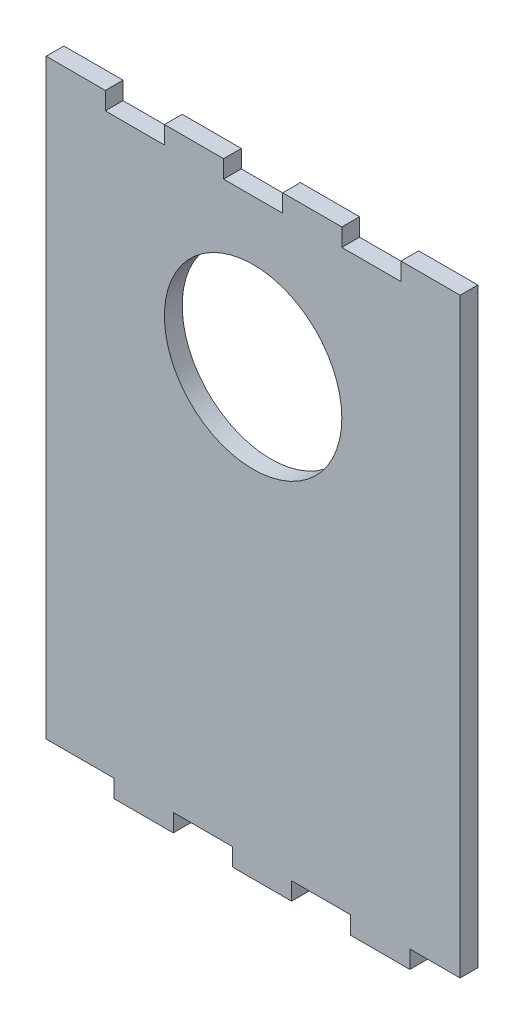
ISO-10303-21;
HEADER;
FILE_DESCRIPTION(('STEP AP214'),'2;1');
FILE_NAME('part.step','',(''),(''),'','','');
FILE_SCHEMA(('AUTOMOTIVE_DESIGN { 1 0 10303 214 1 1 1 1 }'));
ENDSEC;
DATA;
#1=APPLICATION_CONTEXT('core data for automotive mechanical design processes');
#2=APPLICATION_PROTOCOL_DEFINITION('international standard','automotive_design',2000,#1);
#3=PRODUCT_CONTEXT('',#1,'mechanical');
#4=PRODUCT('Part','Part','',(#3));
#5=PRODUCT_RELATED_PRODUCT_CATEGORY('part','',(#4));
#6=PRODUCT_DEFINITION_FORMATION('','',#4);
#7=PRODUCT_DEFINITION_CONTEXT('part definition',#1,'design');
#8=PRODUCT_DEFINITION('design','',#6,#7);
#9=PRODUCT_DEFINITION_SHAPE('','',#8);
#10=(LENGTH_UNIT() NAMED_UNIT(*) SI_UNIT(.MILLI.,.METRE.));
#11=(NAMED_UNIT(*) PLANE_ANGLE_UNIT() SI_UNIT($,.RADIAN.));
#12=(NAMED_UNIT(*) SI_UNIT($,.STERADIAN.) SOLID_ANGLE_UNIT());
#13=UNCERTAINTY_MEASURE_WITH_UNIT(LENGTH_MEASURE(1.E-05),#10,'distance_accuracy_value','');
#14=(GEOMETRIC_REPRESENTATION_CONTEXT(3) GLOBAL_UNCERTAINTY_ASSIGNED_CONTEXT((#13)) GLOBAL_UNIT_ASSIGNED_CONTEXT((#10,
#11,#12)) REPRESENTATION_CONTEXT('',''));
#15=CARTESIAN_POINT('',(0.,0.,0.));
#16=DIRECTION('',(0.,0.,1.));
#17=DIRECTION('',(1.,0.,0.));
#18=AXIS2_PLACEMENT_3D('',#15,#16,#17);
#19=CARTESIAN_POINT('',(0.,50.,3.));
#20=DIRECTION('',(0.,1.,0.));
#21=DIRECTION('',(0.,0.,1.));
#22=AXIS2_PLACEMENT_3D('',#19,#20,#21);
#23=PLANE('',#22);
#24=DIRECTION('',(0.,0.,1.));
#25=VECTOR('',#24,1.);
#26=CARTESIAN_POINT('',(-25.,50.,0.));
#27=LINE('',#26,#25);
#28=CARTESIAN_POINT('',(-25.,50.,0.));
#29=VERTEX_POINT('',#28);
#30=CARTESIAN_POINT('',(-25.,50.,3.));
#31=VERTEX_POINT('',#30);
#32=EDGE_CURVE('E271',#29,#31,#27,.T.);
#33=ORIENTED_EDGE('',*,*,#32,.F.);
#34=DIRECTION('',(1.,0.,0.));
#35=VECTOR('',#34,1.);
#36=CARTESIAN_POINT('',(0.,50.,0.));
#37=LINE('',#36,#35);
#38=CARTESIAN_POINT('',(-35.,50.,0.));
#39=VERTEX_POINT('',#38);
#40=EDGE_CURVE('E253',#39,#29,#37,.T.);
#41=ORIENTED_EDGE('',*,*,#40,.F.);
#42=DIRECTION('',(0.,0.,-1.));
#43=VECTOR('',#42,1.);
#44=CARTESIAN_POINT('',(-35.,50.,3.));
#45=LINE('',#44,#43);
#46=CARTESIAN_POINT('',(-35.,50.,3.));
#47=VERTEX_POINT('',#46);
#48=EDGE_CURVE('E457',#47,#39,#45,.T.);
#49=ORIENTED_EDGE('',*,*,#48,.F.);
#50=DIRECTION('',(1.,0.,0.));
#51=VECTOR('',#50,1.);
#52=CARTESIAN_POINT('',(0.,50.,3.));
#53=LINE('',#52,#51);
#54=EDGE_CURVE('E395',#47,#31,#53,.T.);
#55=ORIENTED_EDGE('',*,*,#54,.T.);
#56=EDGE_LOOP('',(#33,#41,#49,#55));
#57=FACE_BOUND('',#56,.T.);
#58=ADVANCED_FACE('F44',(#57),#23,.T.);
#59=DIRECTION('',(0.,0.,1.));
#60=VECTOR('',#59,1.);
#61=CARTESIAN_POINT('',(15.,50.,0.));
#62=LINE('',#61,#60);
#63=CARTESIAN_POINT('',(15.,50.,0.));
#64=VERTEX_POINT('',#63);
#65=CARTESIAN_POINT('',(15.,50.,3.));
#66=VERTEX_POINT('',#65);
#67=EDGE_CURVE('E291',#64,#66,#62,.T.);
#68=ORIENTED_EDGE('',*,*,#67,.F.);
#69=CARTESIAN_POINT('',(5.,50.,0.));
#70=VERTEX_POINT('',#69);
#71=EDGE_CURVE('E539',#70,#64,#37,.T.);
#72=ORIENTED_EDGE('',*,*,#71,.F.);
#73=DIRECTION('',(0.,0.,1.));
#74=VECTOR('',#73,1.);
#75=CARTESIAN_POINT('',(5.,50.,0.));
#76=LINE('',#75,#74);
#77=CARTESIAN_POINT('',(5.,50.,3.));
#78=VERTEX_POINT('',#77);
#79=EDGE_CURVE('E322',#70,#78,#76,.T.);
#80=ORIENTED_EDGE('',*,*,#79,.T.);
#81=EDGE_CURVE('E984',#78,#66,#53,.T.);
#82=ORIENTED_EDGE('',*,*,#81,.T.);
#83=EDGE_LOOP('',(#68,#72,#80,#82));
#84=FACE_BOUND('',#83,.T.);
#85=ADVANCED_FACE('F609',(#84),#23,.T.);
#86=DIRECTION('',(0.,0.,1.));
#87=VECTOR('',#86,1.);
#88=CARTESIAN_POINT('',(-15.,50.,0.));
#89=LINE('',#88,#87);
#90=CARTESIAN_POINT('',(-15.,50.,0.));
#91=VERTEX_POINT('',#90);
#92=CARTESIAN_POINT('',(-15.,50.,3.));
#93=VERTEX_POINT('',#92);
#94=EDGE_CURVE('E275',#91,#93,#89,.T.);
#95=ORIENTED_EDGE('',*,*,#94,.T.);
#96=CARTESIAN_POINT('',(-5.,50.,3.));
#97=VERTEX_POINT('',#96);
#98=EDGE_CURVE('E400',#93,#97,#53,.T.);
#99=ORIENTED_EDGE('',*,*,#98,.T.);
#100=DIRECTION('',(0.,0.,1.));
#101=VECTOR('',#100,1.);
#102=CARTESIAN_POINT('',(-5.,50.,0.));
#103=LINE('',#102,#101);
#104=CARTESIAN_POINT('',(-5.,50.,0.));
#105=VERTEX_POINT('',#104);
#106=EDGE_CURVE('E326',#105,#97,#103,.T.);
#107=ORIENTED_EDGE('',*,*,#106,.F.);
#108=EDGE_CURVE('E452',#91,#105,#37,.T.);
#109=ORIENTED_EDGE('',*,*,#108,.F.);
#110=EDGE_LOOP('',(#95,#99,#107,#109));
#111=FACE_BOUND('',#110,.T.);
#112=ADVANCED_FACE('F535',(#111),#23,.T.);
#113=CARTESIAN_POINT('',(0.,-50.,3.));
#114=DIRECTION('',(0.,1.,0.));
#115=DIRECTION('',(0.,0.,1.));
#116=AXIS2_PLACEMENT_3D('',#113,#114,#115);
#117=PLANE('',#116);
#118=DIRECTION('',(1.,0.,0.));
#119=VECTOR('',#118,1.);
#120=CARTESIAN_POINT('',(0.,-50.,0.));
#121=LINE('',#120,#119);
#122=CARTESIAN_POINT('',(-35.,-50.,0.));
#123=VERTEX_POINT('',#122);
#124=CARTESIAN_POINT('',(-23.5,-50.,0.));
#125=VERTEX_POINT('',#124);
#126=EDGE_CURVE('E274',#123,#125,#121,.T.);
#127=ORIENTED_EDGE('',*,*,#126,.T.);
#128=DIRECTION('',(0.,0.,-1.));
#129=VECTOR('',#128,1.);
#130=CARTESIAN_POINT('',(-23.5,-50.,3.));
#131=LINE('',#130,#129);
#132=CARTESIAN_POINT('',(-23.5,-50.,3.));
#133=VERTEX_POINT('',#132);
#134=EDGE_CURVE('E11',#133,#125,#131,.T.);
#135=ORIENTED_EDGE('',*,*,#134,.F.);
#136=DIRECTION('',(1.,0.,0.));
#137=VECTOR('',#136,1.);
#138=CARTESIAN_POINT('',(0.,-50.,3.));
#139=LINE('',#138,#137);
#140=CARTESIAN_POINT('',(-35.,-50.,3.));
#141=VERTEX_POINT('',#140);
#142=EDGE_CURVE('E351',#141,#133,#139,.T.);
#143=ORIENTED_EDGE('',*,*,#142,.F.);
#144=DIRECTION('',(0.,0.,-1.));
#145=VECTOR('',#144,1.);
#146=CARTESIAN_POINT('',(-35.,-50.,3.));
#147=LINE('',#146,#145);
#148=EDGE_CURVE('E404',#141,#123,#147,.T.);
#149=ORIENTED_EDGE('',*,*,#148,.T.);
#150=EDGE_LOOP('',(#127,#135,#143,#149));
#151=FACE_BOUND('',#150,.T.);
#152=ADVANCED_FACE('F523',(#151),#117,.F.);
#153=CARTESIAN_POINT('',(-23.5,0.,3.));
#154=DIRECTION('',(1.,0.,0.));
#155=DIRECTION('',(0.,0.,-1.));
#156=AXIS2_PLACEMENT_3D('',#153,#154,#155);
#157=PLANE('',#156);
#158=DIRECTION('',(0.,-1.,0.));
#159=VECTOR('',#158,1.);
#160=CARTESIAN_POINT('',(-23.5,0.,0.));
#161=LINE('',#160,#159);
#162=CARTESIAN_POINT('',(-23.5,-53.,0.));
#163=VERTEX_POINT('',#162);
#164=EDGE_CURVE('E408',#125,#163,#161,.T.);
#165=ORIENTED_EDGE('',*,*,#164,.T.);
#166=DIRECTION('',(0.,0.,-1.));
#167=VECTOR('',#166,1.);
#168=CARTESIAN_POINT('',(-23.5,-53.,3.));
#169=LINE('',#168,#167);
#170=CARTESIAN_POINT('',(-23.5,-53.,3.));
#171=VERTEX_POINT('',#170);
#172=EDGE_CURVE('E53',#171,#163,#169,.T.);
#173=ORIENTED_EDGE('',*,*,#172,.F.);
#174=DIRECTION('',(0.,-1.,0.));
#175=VECTOR('',#174,1.);
#176=CARTESIAN_POINT('',(-23.5,0.,3.));
#177=LINE('',#176,#175);
#178=EDGE_CURVE('E355',#133,#171,#177,.T.);
#179=ORIENTED_EDGE('',*,*,#178,.F.);
#180=ORIENTED_EDGE('',*,*,#134,.T.);
#181=EDGE_LOOP('',(#165,#173,#179,#180));
#182=FACE_BOUND('',#181,.T.);
#183=ADVANCED_FACE('F46',(#182),#157,.F.);
#184=CARTESIAN_POINT('',(0.,-53.,3.));
#185=DIRECTION('',(0.,-1.,0.));
#186=DIRECTION('',(1.,0.,0.));
#187=AXIS2_PLACEMENT_3D('',#184,#185,#186);
#188=PLANE('',#187);
#189=DIRECTION('',(-1.,0.,0.));
#190=VECTOR('',#189,1.);
#191=CARTESIAN_POINT('',(0.,-53.,0.));
#192=LINE('',#191,#190);
#193=CARTESIAN_POINT('',(-13.5,-53.,0.));
#194=VERTEX_POINT('',#193);
#195=EDGE_CURVE('E414',#194,#163,#192,.T.);
#196=ORIENTED_EDGE('',*,*,#195,.F.);
#197=DIRECTION('',(0.,0.,-1.));
#198=VECTOR('',#197,1.);
#199=CARTESIAN_POINT('',(-13.5,-53.,3.));
#200=LINE('',#199,#198);
#201=CARTESIAN_POINT('',(-13.5,-53.,3.));
#202=VERTEX_POINT('',#201);
#203=EDGE_CURVE('E499',#202,#194,#200,.T.);
#204=ORIENTED_EDGE('',*,*,#203,.F.);
#205=DIRECTION('',(-1.,0.,0.));
#206=VECTOR('',#205,1.);
#207=CARTESIAN_POINT('',(0.,-53.,3.));
#208=LINE('',#207,#206);
#209=EDGE_CURVE('E361',#202,#171,#208,.T.);
#210=ORIENTED_EDGE('',*,*,#209,.T.);
#211=ORIENTED_EDGE('',*,*,#172,.T.);
#212=EDGE_LOOP('',(#196,#204,#210,#211));
#213=FACE_BOUND('',#212,.T.);
#214=ADVANCED_FACE('F505',(#213),#188,.T.);
#215=CARTESIAN_POINT('',(-13.5,0.,3.));
#216=DIRECTION('',(1.,0.,0.));
#217=DIRECTION('',(0.,0.,-1.));
#218=AXIS2_PLACEMENT_3D('',#215,#216,#217);
#219=PLANE('',#218);
#220=DIRECTION('',(0.,-1.,0.));
#221=VECTOR('',#220,1.);
#222=CARTESIAN_POINT('',(-13.5,0.,0.));
#223=LINE('',#222,#221);
#224=CARTESIAN_POINT('',(-13.5,-50.,0.));
#225=VERTEX_POINT('',#224);
#226=EDGE_CURVE('E418',#225,#194,#223,.T.);
#227=ORIENTED_EDGE('',*,*,#226,.F.);
#228=DIRECTION('',(0.,0.,-1.));
#229=VECTOR('',#228,1.);
#230=CARTESIAN_POINT('',(-13.5,-50.,3.));
#231=LINE('',#230,#229);
#232=CARTESIAN_POINT('',(-13.5,-50.,3.));
#233=VERTEX_POINT('',#232);
#234=EDGE_CURVE('E496',#233,#225,#231,.T.);
#235=ORIENTED_EDGE('',*,*,#234,.F.);
#236=DIRECTION('',(0.,-1.,0.));
#237=VECTOR('',#236,1.);
#238=CARTESIAN_POINT('',(-13.5,0.,3.));
#239=LINE('',#238,#237);
#240=EDGE_CURVE('E365',#233,#202,#239,.T.);
#241=ORIENTED_EDGE('',*,*,#240,.T.);
#242=ORIENTED_EDGE('',*,*,#203,.T.);
#243=EDGE_LOOP('',(#227,#235,#241,#242));
#244=FACE_BOUND('',#243,.T.);
#245=ADVANCED_FACE('F514',(#244),#219,.T.);
#246=CARTESIAN_POINT('',(-3.5,-50.,0.));
#247=VERTEX_POINT('',#246);
#248=EDGE_CURVE('E410',#225,#247,#121,.T.);
#249=ORIENTED_EDGE('',*,*,#248,.T.);
#250=DIRECTION('',(0.,0.,-1.));
#251=VECTOR('',#250,1.);
#252=CARTESIAN_POINT('',(-3.5,-50.,3.));
#253=LINE('',#252,#251);
#254=CARTESIAN_POINT('',(-3.5,-50.,3.));
#255=VERTEX_POINT('',#254);
#256=EDGE_CURVE('E492',#255,#247,#253,.T.);
#257=ORIENTED_EDGE('',*,*,#256,.F.);
#258=EDGE_CURVE('E358',#233,#255,#139,.T.);
#259=ORIENTED_EDGE('',*,*,#258,.F.);
#260=ORIENTED_EDGE('',*,*,#234,.T.);
#261=EDGE_LOOP('',(#249,#257,#259,#260));
#262=FACE_BOUND('',#261,.T.);
#263=ADVANCED_FACE('F568',(#262),#117,.F.);
#264=CARTESIAN_POINT('',(-3.50000000000001,0.,3.));
#265=DIRECTION('',(1.,0.,0.));
#266=DIRECTION('',(0.,1.,0.));
#267=AXIS2_PLACEMENT_3D('',#264,#265,#266);
#268=PLANE('',#267);
#269=DIRECTION('',(0.,-1.,0.));
#270=VECTOR('',#269,1.);
#271=CARTESIAN_POINT('',(-3.50000000000001,0.,0.));
#272=LINE('',#271,#270);
#273=CARTESIAN_POINT('',(-3.5,-53.,0.));
#274=VERTEX_POINT('',#273);
#275=EDGE_CURVE('E422',#247,#274,#272,.T.);
#276=ORIENTED_EDGE('',*,*,#275,.T.);
#277=DIRECTION('',(0.,0.,-1.));
#278=VECTOR('',#277,1.);
#279=CARTESIAN_POINT('',(-3.5,-53.,3.));
#280=LINE('',#279,#278);
#281=CARTESIAN_POINT('',(-3.5,-53.,3.));
#282=VERTEX_POINT('',#281);
#283=EDGE_CURVE('E488',#282,#274,#280,.T.);
#284=ORIENTED_EDGE('',*,*,#283,.F.);
#285=DIRECTION('',(0.,-1.,0.));
#286=VECTOR('',#285,1.);
#287=CARTESIAN_POINT('',(-3.50000000000001,0.,3.));
#288=LINE('',#287,#286);
#289=EDGE_CURVE('E369',#255,#282,#288,.T.);
#290=ORIENTED_EDGE('',*,*,#289,.F.);
#291=ORIENTED_EDGE('',*,*,#256,.T.);
#292=EDGE_LOOP('',(#276,#284,#290,#291));
#293=FACE_BOUND('',#292,.T.);
#294=ADVANCED_FACE('F571',(#293),#268,.F.);
#295=CARTESIAN_POINT('',(0.,-53.,3.));
#296=DIRECTION('',(0.,1.,0.));
#297=DIRECTION('',(0.,0.,1.));
#298=AXIS2_PLACEMENT_3D('',#295,#296,#297);
#299=PLANE('',#298);
#300=DIRECTION('',(1.,0.,0.));
#301=VECTOR('',#300,1.);
#302=CARTESIAN_POINT('',(0.,-53.,0.));
#303=LINE('',#302,#301);
#304=CARTESIAN_POINT('',(6.5,-53.,0.));
#305=VERTEX_POINT('',#304);
#306=EDGE_CURVE('E425',#274,#305,#303,.T.);
#307=ORIENTED_EDGE('',*,*,#306,.T.);
#308=DIRECTION('',(0.,0.,-1.));
#309=VECTOR('',#308,1.);
#310=CARTESIAN_POINT('',(6.5,-53.,3.));
#311=LINE('',#310,#309);
#312=CARTESIAN_POINT('',(6.5,-53.,3.));
#313=VERTEX_POINT('',#312);
#314=EDGE_CURVE('E485',#313,#305,#311,.T.);
#315=ORIENTED_EDGE('',*,*,#314,.F.);
#316=DIRECTION('',(1.,0.,0.));
#317=VECTOR('',#316,1.);
#318=CARTESIAN_POINT('',(0.,-53.,3.));
#319=LINE('',#318,#317);
#320=EDGE_CURVE('E372',#282,#313,#319,.T.);
#321=ORIENTED_EDGE('',*,*,#320,.F.);
#322=ORIENTED_EDGE('',*,*,#283,.T.);
#323=EDGE_LOOP('',(#307,#315,#321,#322));
#324=FACE_BOUND('',#323,.T.);
#325=ADVANCED_FACE('F577',(#324),#299,.F.);
#326=CARTESIAN_POINT('',(6.5,0.,3.));
#327=DIRECTION('',(1.,0.,0.));
#328=DIRECTION('',(0.,0.,-1.));
#329=AXIS2_PLACEMENT_3D('',#326,#327,#328);
#330=PLANE('',#329);
#331=DIRECTION('',(0.,-1.,0.));
#332=VECTOR('',#331,1.);
#333=CARTESIAN_POINT('',(6.5,0.,0.));
#334=LINE('',#333,#332);
#335=CARTESIAN_POINT('',(6.5,-50.,0.));
#336=VERTEX_POINT('',#335);
#337=EDGE_CURVE('E429',#336,#305,#334,.T.);
#338=ORIENTED_EDGE('',*,*,#337,.F.);
#339=DIRECTION('',(0.,0.,-1.));
#340=VECTOR('',#339,1.);
#341=CARTESIAN_POINT('',(6.5,-50.,3.));
#342=LINE('',#341,#340);
#343=CARTESIAN_POINT('',(6.5,-50.,3.));
#344=VERTEX_POINT('',#343);
#345=EDGE_CURVE('E482',#344,#336,#342,.T.);
#346=ORIENTED_EDGE('',*,*,#345,.F.);
#347=DIRECTION('',(0.,-1.,0.));
#348=VECTOR('',#347,1.);
#349=CARTESIAN_POINT('',(6.5,0.,3.));
#350=LINE('',#349,#348);
#351=EDGE_CURVE('E375',#344,#313,#350,.T.);
#352=ORIENTED_EDGE('',*,*,#351,.T.);
#353=ORIENTED_EDGE('',*,*,#314,.T.);
#354=EDGE_LOOP('',(#338,#346,#352,#353));
#355=FACE_BOUND('',#354,.T.);
#356=ADVANCED_FACE('F598',(#355),#330,.T.);
#357=CARTESIAN_POINT('',(16.5,-50.,0.));
#358=VERTEX_POINT('',#357);
#359=EDGE_CURVE('E433',#336,#358,#121,.T.);
#360=ORIENTED_EDGE('',*,*,#359,.T.);
#361=DIRECTION('',(0.,0.,-1.));
#362=VECTOR('',#361,1.);
#363=CARTESIAN_POINT('',(16.5,-50.,3.));
#364=LINE('',#363,#362);
#365=CARTESIAN_POINT('',(16.5,-50.,3.));
#366=VERTEX_POINT('',#365);
#367=EDGE_CURVE('E478',#366,#358,#364,.T.);
#368=ORIENTED_EDGE('',*,*,#367,.F.);
#369=EDGE_CURVE('E379',#344,#366,#139,.T.);
#370=ORIENTED_EDGE('',*,*,#369,.F.);
#371=ORIENTED_EDGE('',*,*,#345,.T.);
#372=EDGE_LOOP('',(#360,#368,#370,#371));
#373=FACE_BOUND('',#372,.T.);
#374=ADVANCED_FACE('F596',(#373),#117,.F.);
#375=CARTESIAN_POINT('',(16.5000000000001,0.,3.));
#376=DIRECTION('',(1.,0.,0.));
#377=DIRECTION('',(0.,1.,0.));
#378=AXIS2_PLACEMENT_3D('',#375,#376,#377);
#379=PLANE('',#378);
#380=DIRECTION('',(0.,-1.,0.));
#381=VECTOR('',#380,1.);
#382=CARTESIAN_POINT('',(16.5000000000001,0.,0.));
#383=LINE('',#382,#381);
#384=CARTESIAN_POINT('',(16.5,-53.,0.));
#385=VERTEX_POINT('',#384);
#386=EDGE_CURVE('E434',#358,#385,#383,.T.);
#387=ORIENTED_EDGE('',*,*,#386,.T.);
#388=DIRECTION('',(0.,0.,-1.));
#389=VECTOR('',#388,1.);
#390=CARTESIAN_POINT('',(16.5,-53.,3.));
#391=LINE('',#390,#389);
#392=CARTESIAN_POINT('',(16.5,-53.,3.));
#393=VERTEX_POINT('',#392);
#394=EDGE_CURVE('E474',#393,#385,#391,.T.);
#395=ORIENTED_EDGE('',*,*,#394,.F.);
#396=DIRECTION('',(0.,-1.,0.));
#397=VECTOR('',#396,1.);
#398=CARTESIAN_POINT('',(16.5000000000001,0.,3.));
#399=LINE('',#398,#397);
#400=EDGE_CURVE('E380',#366,#393,#399,.T.);
#401=ORIENTED_EDGE('',*,*,#400,.F.);
#402=ORIENTED_EDGE('',*,*,#367,.T.);
#403=EDGE_LOOP('',(#387,#395,#401,#402));
#404=FACE_BOUND('',#403,.T.);
#405=ADVANCED_FACE('F595',(#404),#379,.F.);
#406=CARTESIAN_POINT('',(0.,-53.,3.));
#407=DIRECTION('',(0.,1.,0.));
#408=DIRECTION('',(-1.,0.,0.));
#409=AXIS2_PLACEMENT_3D('',#406,#407,#408);
#410=PLANE('',#409);
#411=DIRECTION('',(1.,0.,0.));
#412=VECTOR('',#411,1.);
#413=CARTESIAN_POINT('',(0.,-53.,0.));
#414=LINE('',#413,#412);
#415=CARTESIAN_POINT('',(26.5,-53.,0.));
#416=VERTEX_POINT('',#415);
#417=EDGE_CURVE('E437',#385,#416,#414,.T.);
#418=ORIENTED_EDGE('',*,*,#417,.T.);
#419=DIRECTION('',(0.,0.,-1.));
#420=VECTOR('',#419,1.);
#421=CARTESIAN_POINT('',(26.5,-53.,3.));
#422=LINE('',#421,#420);
#423=CARTESIAN_POINT('',(26.5,-53.,3.));
#424=VERTEX_POINT('',#423);
#425=EDGE_CURVE('E471',#424,#416,#422,.T.);
#426=ORIENTED_EDGE('',*,*,#425,.F.);
#427=DIRECTION('',(1.,0.,0.));
#428=VECTOR('',#427,1.);
#429=CARTESIAN_POINT('',(0.,-53.,3.));
#430=LINE('',#429,#428);
#431=EDGE_CURVE('E383',#393,#424,#430,.T.);
#432=ORIENTED_EDGE('',*,*,#431,.F.);
#433=ORIENTED_EDGE('',*,*,#394,.T.);
#434=EDGE_LOOP('',(#418,#426,#432,#433));
#435=FACE_BOUND('',#434,.T.);
#436=ADVANCED_FACE('F591',(#435),#410,.F.);
#437=CARTESIAN_POINT('',(26.5,0.,3.));
#438=DIRECTION('',(1.,0.,0.));
#439=DIRECTION('',(0.,0.,-1.));
#440=AXIS2_PLACEMENT_3D('',#437,#438,#439);
#441=PLANE('',#440);
#442=DIRECTION('',(0.,-1.,0.));
#443=VECTOR('',#442,1.);
#444=CARTESIAN_POINT('',(26.5,0.,0.));
#445=LINE('',#444,#443);
#446=CARTESIAN_POINT('',(26.5,-50.,0.));
#447=VERTEX_POINT('',#446);
#448=EDGE_CURVE('E441',#447,#416,#445,.T.);
#449=ORIENTED_EDGE('',*,*,#448,.F.);
#450=DIRECTION('',(0.,0.,-1.));
#451=VECTOR('',#450,1.);
#452=CARTESIAN_POINT('',(26.5,-50.,3.));
#453=LINE('',#452,#451);
#454=CARTESIAN_POINT('',(26.5,-50.,3.));
#455=VERTEX_POINT('',#454);
#456=EDGE_CURVE('E468',#455,#447,#453,.T.);
#457=ORIENTED_EDGE('',*,*,#456,.F.);
#458=DIRECTION('',(0.,-1.,0.));
#459=VECTOR('',#458,1.);
#460=CARTESIAN_POINT('',(26.5,0.,3.));
#461=LINE('',#460,#459);
#462=EDGE_CURVE('E386',#455,#424,#461,.T.);
#463=ORIENTED_EDGE('',*,*,#462,.T.);
#464=ORIENTED_EDGE('',*,*,#425,.T.);
#465=EDGE_LOOP('',(#449,#457,#463,#464));
#466=FACE_BOUND('',#465,.T.);
#467=ADVANCED_FACE('F587',(#466),#441,.T.);
#468=CARTESIAN_POINT('',(35.,-50.,0.));
#469=VERTEX_POINT('',#468);
#470=EDGE_CURVE('E409',#447,#469,#121,.T.);
#471=ORIENTED_EDGE('',*,*,#470,.T.);
#472=DIRECTION('',(0.,0.,-1.));
#473=VECTOR('',#472,1.);
#474=CARTESIAN_POINT('',(35.,-50.,3.));
#475=LINE('',#474,#473);
#476=CARTESIAN_POINT('',(35.,-50.,3.));
#477=VERTEX_POINT('',#476);
#478=EDGE_CURVE('E464',#477,#469,#475,.T.);
#479=ORIENTED_EDGE('',*,*,#478,.F.);
#480=EDGE_CURVE('E357',#455,#477,#139,.T.);
#481=ORIENTED_EDGE('',*,*,#480,.F.);
#482=ORIENTED_EDGE('',*,*,#456,.T.);
#483=EDGE_LOOP('',(#471,#479,#481,#482));
#484=FACE_BOUND('',#483,.T.);
#485=ADVANCED_FACE('F557',(#484),#117,.F.);
#486=CARTESIAN_POINT('',(35.,0.,3.));
#487=DIRECTION('',(-1.,0.,0.));
#488=DIRECTION('',(0.,0.,1.));
#489=AXIS2_PLACEMENT_3D('',#486,#487,#488);
#490=PLANE('',#489);
#491=DIRECTION('',(0.,1.,0.));
#492=VECTOR('',#491,1.);
#493=CARTESIAN_POINT('',(35.,0.,0.));
#494=LINE('',#493,#492);
#495=CARTESIAN_POINT('',(35.,50.,0.));
#496=VERTEX_POINT('',#495);
#497=EDGE_CURVE('E445',#469,#496,#494,.T.);
#498=ORIENTED_EDGE('',*,*,#497,.T.);
#499=DIRECTION('',(0.,0.,-1.));
#500=VECTOR('',#499,1.);
#501=CARTESIAN_POINT('',(35.,50.,3.));
#502=LINE('',#501,#500);
#503=CARTESIAN_POINT('',(35.,50.,3.));
#504=VERTEX_POINT('',#503);
#505=EDGE_CURVE('E460',#504,#496,#502,.T.);
#506=ORIENTED_EDGE('',*,*,#505,.F.);
#507=DIRECTION('',(0.,1.,0.));
#508=VECTOR('',#507,1.);
#509=CARTESIAN_POINT('',(35.,0.,3.));
#510=LINE('',#509,#508);
#511=EDGE_CURVE('E390',#477,#504,#510,.T.);
#512=ORIENTED_EDGE('',*,*,#511,.F.);
#513=ORIENTED_EDGE('',*,*,#478,.T.);
#514=EDGE_LOOP('',(#498,#506,#512,#513));
#515=FACE_BOUND('',#514,.T.);
#516=ADVANCED_FACE('F553',(#515),#490,.F.);
#517=DIRECTION('',(0.,0.,1.));
#518=VECTOR('',#517,1.);
#519=CARTESIAN_POINT('',(25.,50.,0.));
#520=LINE('',#519,#518);
#521=CARTESIAN_POINT('',(25.,50.,0.));
#522=VERTEX_POINT('',#521);
#523=CARTESIAN_POINT('',(25.,50.,3.));
#524=VERTEX_POINT('',#523);
#525=EDGE_CURVE('E287',#522,#524,#520,.T.);
#526=ORIENTED_EDGE('',*,*,#525,.T.);
#527=EDGE_CURVE('E394',#524,#504,#53,.T.);
#528=ORIENTED_EDGE('',*,*,#527,.T.);
#529=ORIENTED_EDGE('',*,*,#505,.T.);
#530=EDGE_CURVE('E449',#522,#496,#37,.T.);
#531=ORIENTED_EDGE('',*,*,#530,.F.);
#532=EDGE_LOOP('',(#526,#528,#529,#531));
#533=FACE_BOUND('',#532,.T.);
#534=ADVANCED_FACE('F549',(#533),#23,.T.);
#535=CARTESIAN_POINT('',(-35.,0.,3.));
#536=DIRECTION('',(-1.,0.,0.));
#537=DIRECTION('',(0.,0.,1.));
#538=AXIS2_PLACEMENT_3D('',#535,#536,#537);
#539=PLANE('',#538);
#540=DIRECTION('',(0.,1.,0.));
#541=VECTOR('',#540,1.);
#542=CARTESIAN_POINT('',(-35.,0.,0.));
#543=LINE('',#542,#541);
#544=EDGE_CURVE('E356',#123,#39,#543,.T.);
#545=ORIENTED_EDGE('',*,*,#544,.F.);
#546=ORIENTED_EDGE('',*,*,#148,.F.);
#547=DIRECTION('',(0.,1.,0.));
#548=VECTOR('',#547,1.);
#549=CARTESIAN_POINT('',(-35.,0.,3.));
#550=LINE('',#549,#548);
#551=EDGE_CURVE('E399',#141,#47,#550,.T.);
#552=ORIENTED_EDGE('',*,*,#551,.T.);
#553=ORIENTED_EDGE('',*,*,#48,.T.);
#554=EDGE_LOOP('',(#545,#546,#552,#553));
#555=FACE_BOUND('',#554,.T.);
#556=ADVANCED_FACE('F526',(#555),#539,.T.);
#557=CARTESIAN_POINT('',(0.,0.,3.));
#558=DIRECTION('',(0.,0.,1.));
#559=DIRECTION('',(1.,0.,0.));
#560=AXIS2_PLACEMENT_3D('',#557,#558,#559);
#561=PLANE('',#560);
#562=CARTESIAN_POINT('',(0.,22.,3.));
#563=DIRECTION('',(0.,0.,1.));
#564=DIRECTION('',(1.,0.,0.));
#565=AXIS2_PLACEMENT_3D('',#562,#563,#564);
#566=CIRCLE('',#565,15.);
#567=CARTESIAN_POINT('',(15.,22.,3.));
#568=VERTEX_POINT('',#567);
#569=EDGE_CURVE('E261',#568,#568,#566,.T.);
#570=ORIENTED_EDGE('',*,*,#569,.F.);
#571=EDGE_LOOP('',(#570));
#572=FACE_BOUND('',#571,.T.);
#573=DIRECTION('',(0.,-1.,0.));
#574=VECTOR('',#573,1.);
#575=CARTESIAN_POINT('',(-25.,50.,3.));
#576=LINE('',#575,#574);
#577=CARTESIAN_POINT('',(-25.,47.,3.));
#578=VERTEX_POINT('',#577);
#579=EDGE_CURVE('E236',#31,#578,#576,.T.);
#580=ORIENTED_EDGE('',*,*,#579,.F.);
#581=ORIENTED_EDGE('',*,*,#54,.F.);
#582=ORIENTED_EDGE('',*,*,#551,.F.);
#583=ORIENTED_EDGE('',*,*,#142,.T.);
#584=ORIENTED_EDGE('',*,*,#178,.T.);
#585=ORIENTED_EDGE('',*,*,#209,.F.);
#586=ORIENTED_EDGE('',*,*,#240,.F.);
#587=ORIENTED_EDGE('',*,*,#258,.T.);
#588=ORIENTED_EDGE('',*,*,#289,.T.);
#589=ORIENTED_EDGE('',*,*,#320,.T.);
#590=ORIENTED_EDGE('',*,*,#351,.F.);
#591=ORIENTED_EDGE('',*,*,#369,.T.);
#592=ORIENTED_EDGE('',*,*,#400,.T.);
#593=ORIENTED_EDGE('',*,*,#431,.T.);
#594=ORIENTED_EDGE('',*,*,#462,.F.);
#595=ORIENTED_EDGE('',*,*,#480,.T.);
#596=ORIENTED_EDGE('',*,*,#511,.T.);
#597=ORIENTED_EDGE('',*,*,#527,.F.);
#598=DIRECTION('',(0.,1.,0.));
#599=VECTOR('',#598,1.);
#600=CARTESIAN_POINT('',(25.,50.,3.));
#601=LINE('',#600,#599);
#602=CARTESIAN_POINT('',(25.,47.,3.));
#603=VERTEX_POINT('',#602);
#604=EDGE_CURVE('E295',#603,#524,#601,.T.);
#605=ORIENTED_EDGE('',*,*,#604,.F.);
#606=DIRECTION('',(1.,0.,0.));
#607=VECTOR('',#606,1.);
#608=CARTESIAN_POINT('',(15.,47.,3.));
#609=LINE('',#608,#607);
#610=CARTESIAN_POINT('',(15.,47.,3.));
#611=VERTEX_POINT('',#610);
#612=EDGE_CURVE('E298',#611,#603,#609,.T.);
#613=ORIENTED_EDGE('',*,*,#612,.F.);
#614=DIRECTION('',(0.,-1.,0.));
#615=VECTOR('',#614,1.);
#616=CARTESIAN_POINT('',(15.,50.,3.));
#617=LINE('',#616,#615);
#618=EDGE_CURVE('E268',#66,#611,#617,.T.);
#619=ORIENTED_EDGE('',*,*,#618,.F.);
#620=ORIENTED_EDGE('',*,*,#81,.F.);
#621=DIRECTION('',(0.,1.,0.));
#622=VECTOR('',#621,1.);
#623=CARTESIAN_POINT('',(5.,50.,3.));
#624=LINE('',#623,#622);
#625=CARTESIAN_POINT('',(5.,47.,3.));
#626=VERTEX_POINT('',#625);
#627=EDGE_CURVE('E330',#626,#78,#624,.T.);
#628=ORIENTED_EDGE('',*,*,#627,.F.);
#629=DIRECTION('',(1.,0.,0.));
#630=VECTOR('',#629,1.);
#631=CARTESIAN_POINT('',(-5.,47.,3.));
#632=LINE('',#631,#630);
#633=CARTESIAN_POINT('',(-5.,47.,3.));
#634=VERTEX_POINT('',#633);
#635=EDGE_CURVE('E333',#634,#626,#632,.T.);
#636=ORIENTED_EDGE('',*,*,#635,.F.);
#637=DIRECTION('',(0.,-1.,0.));
#638=VECTOR('',#637,1.);
#639=CARTESIAN_POINT('',(-5.,50.,3.));
#640=LINE('',#639,#638);
#641=EDGE_CURVE('E294',#97,#634,#640,.T.);
#642=ORIENTED_EDGE('',*,*,#641,.F.);
#643=ORIENTED_EDGE('',*,*,#98,.F.);
#644=DIRECTION('',(0.,1.,0.));
#645=VECTOR('',#644,1.);
#646=CARTESIAN_POINT('',(-15.,50.,3.));
#647=LINE('',#646,#645);
#648=CARTESIAN_POINT('',(-15.,47.,3.));
#649=VERTEX_POINT('',#648);
#650=EDGE_CURVE('E255',#649,#93,#647,.T.);
#651=ORIENTED_EDGE('',*,*,#650,.F.);
#652=DIRECTION('',(1.,0.,0.));
#653=VECTOR('',#652,1.);
#654=CARTESIAN_POINT('',(-25.,47.,3.));
#655=LINE('',#654,#653);
#656=EDGE_CURVE('E258',#578,#649,#655,.T.);
#657=ORIENTED_EDGE('',*,*,#656,.F.);
#658=EDGE_LOOP('',(#580,#581,#582,#583,#584,#585,#586,#587,#588,#589,#590,#591,#592,#593,#594,
#595,#596,#597,#605,#613,#619,#620,#628,#636,#642,#643,#651,#657));
#659=FACE_BOUND('',#658,.T.);
#660=ADVANCED_FACE('F518',(#572,#659),#561,.T.);
#661=CARTESIAN_POINT('',(0.,0.,0.));
#662=DIRECTION('',(0.,0.,1.));
#663=DIRECTION('',(1.,0.,0.));
#664=AXIS2_PLACEMENT_3D('',#661,#662,#663);
#665=PLANE('',#664);
#666=CARTESIAN_POINT('',(0.,22.,0.));
#667=DIRECTION('',(0.,0.,1.));
#668=DIRECTION('',(1.,0.,0.));
#669=AXIS2_PLACEMENT_3D('',#666,#667,#668);
#670=CIRCLE('',#669,15.);
#671=CARTESIAN_POINT('',(15.,22.,0.));
#672=VERTEX_POINT('',#671);
#673=EDGE_CURVE('E329',#672,#672,#670,.T.);
#674=ORIENTED_EDGE('',*,*,#673,.T.);
#675=EDGE_LOOP('',(#674));
#676=FACE_BOUND('',#675,.T.);
#677=ORIENTED_EDGE('',*,*,#40,.T.);
#678=DIRECTION('',(0.,-1.,0.));
#679=VECTOR('',#678,1.);
#680=CARTESIAN_POINT('',(-25.,50.,0.));
#681=LINE('',#680,#679);
#682=CARTESIAN_POINT('',(-25.,47.,0.));
#683=VERTEX_POINT('',#682);
#684=EDGE_CURVE('E233',#29,#683,#681,.T.);
#685=ORIENTED_EDGE('',*,*,#684,.T.);
#686=DIRECTION('',(1.,0.,0.));
#687=VECTOR('',#686,1.);
#688=CARTESIAN_POINT('',(-25.,47.,0.));
#689=LINE('',#688,#687);
#690=CARTESIAN_POINT('',(-15.,47.,0.));
#691=VERTEX_POINT('',#690);
#692=EDGE_CURVE('E244',#683,#691,#689,.T.);
#693=ORIENTED_EDGE('',*,*,#692,.T.);
#694=DIRECTION('',(0.,1.,0.));
#695=VECTOR('',#694,1.);
#696=CARTESIAN_POINT('',(-15.,50.,0.));
#697=LINE('',#696,#695);
#698=EDGE_CURVE('E60',#691,#91,#697,.T.);
#699=ORIENTED_EDGE('',*,*,#698,.T.);
#700=ORIENTED_EDGE('',*,*,#108,.T.);
#701=DIRECTION('',(0.,-1.,0.));
#702=VECTOR('',#701,1.);
#703=CARTESIAN_POINT('',(-5.,50.,0.));
#704=LINE('',#703,#702);
#705=CARTESIAN_POINT('',(-5.,47.,0.));
#706=VERTEX_POINT('',#705);
#707=EDGE_CURVE('E334',#105,#706,#704,.T.);
#708=ORIENTED_EDGE('',*,*,#707,.T.);
#709=DIRECTION('',(1.,0.,0.));
#710=VECTOR('',#709,1.);
#711=CARTESIAN_POINT('',(-5.,47.,0.));
#712=LINE('',#711,#710);
#713=CARTESIAN_POINT('',(5.,47.,0.));
#714=VERTEX_POINT('',#713);
#715=EDGE_CURVE('E344',#706,#714,#712,.T.);
#716=ORIENTED_EDGE('',*,*,#715,.T.);
#717=DIRECTION('',(0.,1.,0.));
#718=VECTOR('',#717,1.);
#719=CARTESIAN_POINT('',(5.,50.,0.));
#720=LINE('',#719,#718);
#721=EDGE_CURVE('E318',#714,#70,#720,.T.);
#722=ORIENTED_EDGE('',*,*,#721,.T.);
#723=ORIENTED_EDGE('',*,*,#71,.T.);
#724=DIRECTION('',(0.,-1.,0.));
#725=VECTOR('',#724,1.);
#726=CARTESIAN_POINT('',(15.,50.,0.));
#727=LINE('',#726,#725);
#728=CARTESIAN_POINT('',(15.,47.,0.));
#729=VERTEX_POINT('',#728);
#730=EDGE_CURVE('E299',#64,#729,#727,.T.);
#731=ORIENTED_EDGE('',*,*,#730,.T.);
#732=DIRECTION('',(1.,0.,0.));
#733=VECTOR('',#732,1.);
#734=CARTESIAN_POINT('',(15.,47.,0.));
#735=LINE('',#734,#733);
#736=CARTESIAN_POINT('',(25.,47.,0.));
#737=VERTEX_POINT('',#736);
#738=EDGE_CURVE('E308',#729,#737,#735,.T.);
#739=ORIENTED_EDGE('',*,*,#738,.T.);
#740=DIRECTION('',(0.,1.,0.));
#741=VECTOR('',#740,1.);
#742=CARTESIAN_POINT('',(25.,50.,0.));
#743=LINE('',#742,#741);
#744=EDGE_CURVE('E68',#737,#522,#743,.T.);
#745=ORIENTED_EDGE('',*,*,#744,.T.);
#746=ORIENTED_EDGE('',*,*,#530,.T.);
#747=ORIENTED_EDGE('',*,*,#497,.F.);
#748=ORIENTED_EDGE('',*,*,#470,.F.);
#749=ORIENTED_EDGE('',*,*,#448,.T.);
#750=ORIENTED_EDGE('',*,*,#417,.F.);
#751=ORIENTED_EDGE('',*,*,#386,.F.);
#752=ORIENTED_EDGE('',*,*,#359,.F.);
#753=ORIENTED_EDGE('',*,*,#337,.T.);
#754=ORIENTED_EDGE('',*,*,#306,.F.);
#755=ORIENTED_EDGE('',*,*,#275,.F.);
#756=ORIENTED_EDGE('',*,*,#248,.F.);
#757=ORIENTED_EDGE('',*,*,#226,.T.);
#758=ORIENTED_EDGE('',*,*,#195,.T.);
#759=ORIENTED_EDGE('',*,*,#164,.F.);
#760=ORIENTED_EDGE('',*,*,#126,.F.);
#761=ORIENTED_EDGE('',*,*,#544,.T.);
#762=EDGE_LOOP('',(#677,#685,#693,#699,#700,#708,#716,#722,#723,#731,#739,#745,#746,#747,#748,
#749,#750,#751,#752,#753,#754,#755,#756,#757,#758,#759,#760,#761));
#763=FACE_BOUND('',#762,.T.);
#764=ADVANCED_FACE('F250',(#676,#763),#665,.F.);
#765=CARTESIAN_POINT('',(-5.,50.,0.));
#766=DIRECTION('',(-1.,0.,0.));
#767=DIRECTION('',(0.,0.,1.));
#768=AXIS2_PLACEMENT_3D('',#765,#766,#767);
#769=PLANE('',#768);
#770=ORIENTED_EDGE('',*,*,#641,.T.);
#771=DIRECTION('',(0.,0.,1.));
#772=VECTOR('',#771,1.);
#773=CARTESIAN_POINT('',(-5.,47.,0.));
#774=LINE('',#773,#772);
#775=EDGE_CURVE('E315',#706,#634,#774,.T.);
#776=ORIENTED_EDGE('',*,*,#775,.F.);
#777=ORIENTED_EDGE('',*,*,#707,.F.);
#778=ORIENTED_EDGE('',*,*,#106,.T.);
#779=EDGE_LOOP('',(#770,#776,#777,#778));
#780=FACE_BOUND('',#779,.T.);
#781=ADVANCED_FACE('F703',(#780),#769,.F.);
#782=CARTESIAN_POINT('',(5.,50.,0.));
#783=DIRECTION('',(1.,0.,0.));
#784=DIRECTION('',(0.,0.,-1.));
#785=AXIS2_PLACEMENT_3D('',#782,#783,#784);
#786=PLANE('',#785);
#787=ORIENTED_EDGE('',*,*,#627,.T.);
#788=ORIENTED_EDGE('',*,*,#79,.F.);
#789=ORIENTED_EDGE('',*,*,#721,.F.);
#790=DIRECTION('',(0.,0.,1.));
#791=VECTOR('',#790,1.);
#792=CARTESIAN_POINT('',(5.,47.,0.));
#793=LINE('',#792,#791);
#794=EDGE_CURVE('E319',#714,#626,#793,.T.);
#795=ORIENTED_EDGE('',*,*,#794,.T.);
#796=EDGE_LOOP('',(#787,#788,#789,#795));
#797=FACE_BOUND('',#796,.T.);
#798=ADVANCED_FACE('F707',(#797),#786,.F.);
#799=CARTESIAN_POINT('',(-5.,47.,0.));
#800=DIRECTION('',(0.,-1.,0.));
#801=DIRECTION('',(0.,0.,-1.));
#802=AXIS2_PLACEMENT_3D('',#799,#800,#801);
#803=PLANE('',#802);
#804=ORIENTED_EDGE('',*,*,#635,.T.);
#805=ORIENTED_EDGE('',*,*,#794,.F.);
#806=ORIENTED_EDGE('',*,*,#715,.F.);
#807=ORIENTED_EDGE('',*,*,#775,.T.);
#808=EDGE_LOOP('',(#804,#805,#806,#807));
#809=FACE_BOUND('',#808,.T.);
#810=ADVANCED_FACE('F719',(#809),#803,.F.);
#811=CARTESIAN_POINT('',(15.,50.,0.));
#812=DIRECTION('',(-1.,0.,0.));
#813=DIRECTION('',(0.,-1.,0.));
#814=AXIS2_PLACEMENT_3D('',#811,#812,#813);
#815=PLANE('',#814);
#816=ORIENTED_EDGE('',*,*,#618,.T.);
#817=DIRECTION('',(0.,0.,1.));
#818=VECTOR('',#817,1.);
#819=CARTESIAN_POINT('',(15.,47.,0.));
#820=LINE('',#819,#818);
#821=EDGE_CURVE('E281',#729,#611,#820,.T.);
#822=ORIENTED_EDGE('',*,*,#821,.F.);
#823=ORIENTED_EDGE('',*,*,#730,.F.);
#824=ORIENTED_EDGE('',*,*,#67,.T.);
#825=EDGE_LOOP('',(#816,#822,#823,#824));
#826=FACE_BOUND('',#825,.T.);
#827=ADVANCED_FACE('F730',(#826),#815,.F.);
#828=CARTESIAN_POINT('',(25.,50.,0.));
#829=DIRECTION('',(1.,0.,0.));
#830=DIRECTION('',(0.,0.,-1.));
#831=AXIS2_PLACEMENT_3D('',#828,#829,#830);
#832=PLANE('',#831);
#833=ORIENTED_EDGE('',*,*,#604,.T.);
#834=ORIENTED_EDGE('',*,*,#525,.F.);
#835=ORIENTED_EDGE('',*,*,#744,.F.);
#836=DIRECTION('',(0.,0.,1.));
#837=VECTOR('',#836,1.);
#838=CARTESIAN_POINT('',(25.,47.,0.));
#839=LINE('',#838,#837);
#840=EDGE_CURVE('E284',#737,#603,#839,.T.);
#841=ORIENTED_EDGE('',*,*,#840,.T.);
#842=EDGE_LOOP('',(#833,#834,#835,#841));
#843=FACE_BOUND('',#842,.T.);
#844=ADVANCED_FACE('F741',(#843),#832,.F.);
#845=CARTESIAN_POINT('',(15.,47.,0.));
#846=DIRECTION('',(0.,-1.,0.));
#847=DIRECTION('',(1.,0.,0.));
#848=AXIS2_PLACEMENT_3D('',#845,#846,#847);
#849=PLANE('',#848);
#850=ORIENTED_EDGE('',*,*,#612,.T.);
#851=ORIENTED_EDGE('',*,*,#840,.F.);
#852=ORIENTED_EDGE('',*,*,#738,.F.);
#853=ORIENTED_EDGE('',*,*,#821,.T.);
#854=EDGE_LOOP('',(#850,#851,#852,#853));
#855=FACE_BOUND('',#854,.T.);
#856=ADVANCED_FACE('F752',(#855),#849,.F.);
#857=CARTESIAN_POINT('',(-25.,50.,0.));
#858=DIRECTION('',(-1.,0.,0.));
#859=DIRECTION('',(0.,0.,1.));
#860=AXIS2_PLACEMENT_3D('',#857,#858,#859);
#861=PLANE('',#860);
#862=ORIENTED_EDGE('',*,*,#579,.T.);
#863=DIRECTION('',(0.,0.,1.));
#864=VECTOR('',#863,1.);
#865=CARTESIAN_POINT('',(-25.,47.,0.));
#866=LINE('',#865,#864);
#867=EDGE_CURVE('E229',#683,#578,#866,.T.);
#868=ORIENTED_EDGE('',*,*,#867,.F.);
#869=ORIENTED_EDGE('',*,*,#684,.F.);
#870=ORIENTED_EDGE('',*,*,#32,.T.);
#871=EDGE_LOOP('',(#862,#868,#869,#870));
#872=FACE_BOUND('',#871,.T.);
#873=ADVANCED_FACE('F231',(#872),#861,.F.);
#874=CARTESIAN_POINT('',(-15.,50.,0.));
#875=DIRECTION('',(1.,0.,0.));
#876=DIRECTION('',(0.,0.,-1.));
#877=AXIS2_PLACEMENT_3D('',#874,#875,#876);
#878=PLANE('',#877);
#879=ORIENTED_EDGE('',*,*,#650,.T.);
#880=ORIENTED_EDGE('',*,*,#94,.F.);
#881=ORIENTED_EDGE('',*,*,#698,.F.);
#882=DIRECTION('',(0.,0.,1.));
#883=VECTOR('',#882,1.);
#884=CARTESIAN_POINT('',(-15.,47.,0.));
#885=LINE('',#884,#883);
#886=EDGE_CURVE('E241',#691,#649,#885,.T.);
#887=ORIENTED_EDGE('',*,*,#886,.T.);
#888=EDGE_LOOP('',(#879,#880,#881,#887));
#889=FACE_BOUND('',#888,.T.);
#890=ADVANCED_FACE('F532',(#889),#878,.F.);
#891=CARTESIAN_POINT('',(-25.,47.,0.));
#892=DIRECTION('',(0.,-1.,0.));
#893=DIRECTION('',(1.,0.,0.));
#894=AXIS2_PLACEMENT_3D('',#891,#892,#893);
#895=PLANE('',#894);
#896=ORIENTED_EDGE('',*,*,#656,.T.);
#897=ORIENTED_EDGE('',*,*,#886,.F.);
#898=ORIENTED_EDGE('',*,*,#692,.F.);
#899=ORIENTED_EDGE('',*,*,#867,.T.);
#900=EDGE_LOOP('',(#896,#897,#898,#899));
#901=FACE_BOUND('',#900,.T.);
#902=ADVANCED_FACE('F245',(#901),#895,.F.);
#903=CARTESIAN_POINT('',(0.,22.,0.));
#904=DIRECTION('',(0.,0.,1.));
#905=DIRECTION('',(1.,0.,0.));
#906=AXIS2_PLACEMENT_3D('',#903,#904,#905);
#907=CYLINDRICAL_SURFACE('',#906,15.);
#908=ORIENTED_EDGE('',*,*,#673,.F.);
#909=EDGE_LOOP('',(#908));
#910=FACE_BOUND('',#909,.T.);
#911=ORIENTED_EDGE('',*,*,#569,.T.);
#912=EDGE_LOOP('',(#911));
#913=FACE_BOUND('',#912,.T.);
#914=ADVANCED_FACE('F790',(#910,#913),#907,.F.);
#915=CLOSED_SHELL('',(#58,#85,#112,#152,#183,#214,#245,#263,#294,#325,#356,#374,#405,#436,#467,
#485,#516,#534,#556,#660,#764,#781,#798,#810,#827,#844,#856,#873,#890,#902,#914));
#916=MANIFOLD_SOLID_BREP('B2',#915);
#917=ADVANCED_BREP_SHAPE_REPRESENTATION('',(#18,#916),#14);
#918=SHAPE_DEFINITION_REPRESENTATION(#9,#917);
ENDSEC;
END-ISO-10303-21;
